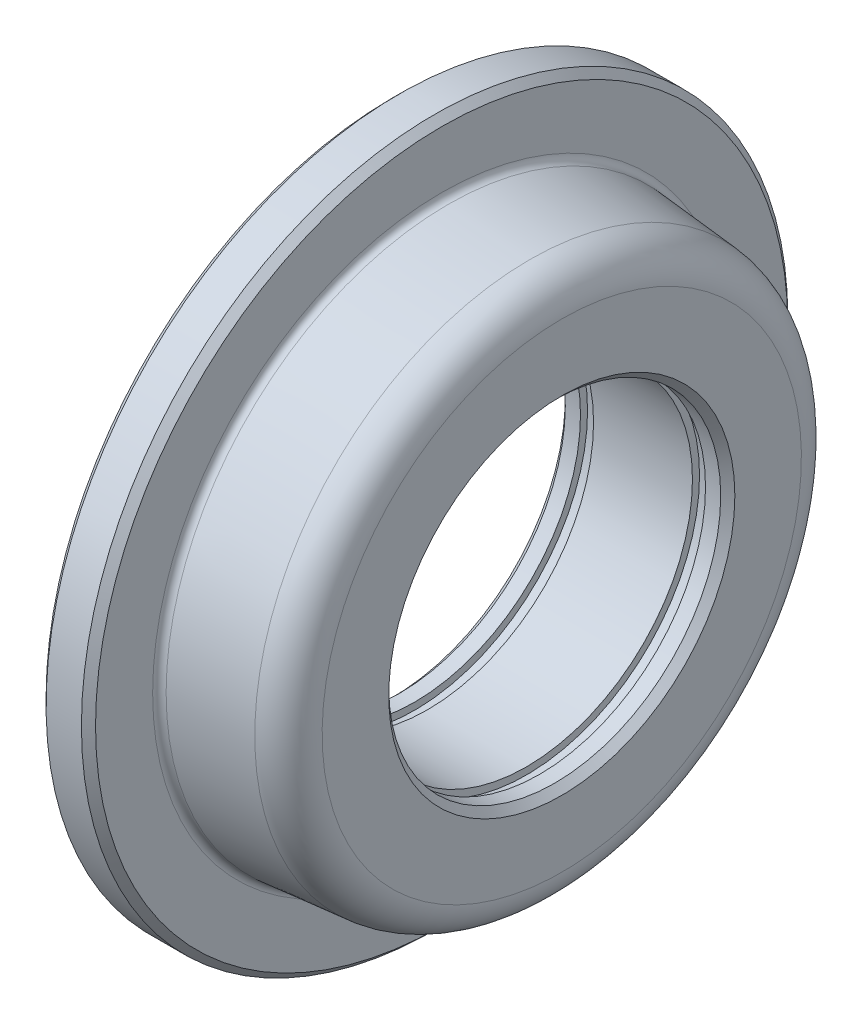
ISO-10303-21;
HEADER;
FILE_DESCRIPTION(('STEP AP214'),'2;1');
FILE_NAME('part.step','',(''),(''),'','','');
FILE_SCHEMA(('AUTOMOTIVE_DESIGN { 1 0 10303 214 1 1 1 1 }'));
ENDSEC;
DATA;
#1=APPLICATION_CONTEXT('core data for automotive mechanical design processes');
#2=APPLICATION_PROTOCOL_DEFINITION('international standard','automotive_design',2000,#1);
#3=PRODUCT_CONTEXT('',#1,'mechanical');
#4=PRODUCT('Part','Part','',(#3));
#5=PRODUCT_RELATED_PRODUCT_CATEGORY('part','',(#4));
#6=PRODUCT_DEFINITION_FORMATION('','',#4);
#7=PRODUCT_DEFINITION_CONTEXT('part definition',#1,'design');
#8=PRODUCT_DEFINITION('design','',#6,#7);
#9=PRODUCT_DEFINITION_SHAPE('','',#8);
#10=(LENGTH_UNIT() NAMED_UNIT(*) SI_UNIT(.MILLI.,.METRE.));
#11=(NAMED_UNIT(*) PLANE_ANGLE_UNIT() SI_UNIT($,.RADIAN.));
#12=(NAMED_UNIT(*) SI_UNIT($,.STERADIAN.) SOLID_ANGLE_UNIT());
#13=UNCERTAINTY_MEASURE_WITH_UNIT(LENGTH_MEASURE(1.E-05),#10,'distance_accuracy_value','');
#14=(GEOMETRIC_REPRESENTATION_CONTEXT(3) GLOBAL_UNCERTAINTY_ASSIGNED_CONTEXT((#13)) GLOBAL_UNIT_ASSIGNED_CONTEXT((#10,
#11,#12)) REPRESENTATION_CONTEXT('',''));
#15=CARTESIAN_POINT('',(0.,0.,0.));
#16=DIRECTION('',(0.,0.,1.));
#17=DIRECTION('',(1.,0.,0.));
#18=AXIS2_PLACEMENT_3D('',#15,#16,#17);
#19=CARTESIAN_POINT('',(22.425,0.,0.));
#20=DIRECTION('',(1.,0.,0.));
#21=DIRECTION('',(0.,0.,-1.));
#22=AXIS2_PLACEMENT_3D('',#19,#20,#21);
#23=CYLINDRICAL_SURFACE('',#22,23.5);
#24=CARTESIAN_POINT('',(23.0000000000013,0.,0.));
#25=DIRECTION('',(1.,0.,0.));
#26=DIRECTION('',(0.,-1.,0.));
#27=AXIS2_PLACEMENT_3D('',#24,#25,#26);
#28=CIRCLE('',#27,23.4999999999987);
#29=CARTESIAN_POINT('',(23.0000000000013,-23.4999999999987,0.));
#30=VERTEX_POINT('',#29);
#31=EDGE_CURVE('E67',#30,#30,#28,.T.);
#32=ORIENTED_EDGE('',*,*,#31,.T.);
#33=EDGE_LOOP('',(#32));
#34=FACE_BOUND('',#33,.T.);
#35=CARTESIAN_POINT('',(20.85,0.,0.));
#36=DIRECTION('',(1.,0.,0.));
#37=DIRECTION('',(0.,0.,-1.));
#38=AXIS2_PLACEMENT_3D('',#35,#36,#37);
#39=CIRCLE('',#38,23.5);
#40=CARTESIAN_POINT('',(20.85,0.,-23.5));
#41=VERTEX_POINT('',#40);
#42=EDGE_CURVE('E18',#41,#41,#39,.T.);
#43=ORIENTED_EDGE('',*,*,#42,.F.);
#44=EDGE_LOOP('',(#43));
#45=FACE_BOUND('',#44,.T.);
#46=ADVANCED_FACE('F15',(#34,#45),#23,.F.);
#47=CARTESIAN_POINT('',(23.9999999999987,0.,0.));
#48=DIRECTION('',(1.,0.,0.));
#49=DIRECTION('',(0.,0.,-1.));
#50=AXIS2_PLACEMENT_3D('',#47,#48,#49);
#51=CONICAL_SURFACE('',#50,24.5000000000013,0.785398163400002);
#52=ORIENTED_EDGE('',*,*,#31,.F.);
#53=EDGE_LOOP('',(#52));
#54=FACE_BOUND('',#53,.T.);
#55=CARTESIAN_POINT('',(23.9999999999987,0.,0.));
#56=DIRECTION('',(1.,0.,0.));
#57=DIRECTION('',(0.,0.,-1.));
#58=AXIS2_PLACEMENT_3D('',#55,#56,#57);
#59=CIRCLE('',#58,24.5000000000013);
#60=CARTESIAN_POINT('',(23.9999999999987,0.,-24.5000000000013));
#61=VERTEX_POINT('',#60);
#62=EDGE_CURVE('E62',#61,#61,#59,.F.);
#63=ORIENTED_EDGE('',*,*,#62,.F.);
#64=EDGE_LOOP('',(#63));
#65=FACE_BOUND('',#64,.T.);
#66=ADVANCED_FACE('F116',(#54,#65),#51,.F.);
#67=CARTESIAN_POINT('',(20.85,24.5,0.));
#68=DIRECTION('',(-1.,0.,0.));
#69=DIRECTION('',(0.,0.,1.));
#70=AXIS2_PLACEMENT_3D('',#67,#68,#69);
#71=PLANE('',#70);
#72=ORIENTED_EDGE('',*,*,#42,.T.);
#73=EDGE_LOOP('',(#72));
#74=FACE_BOUND('',#73,.T.);
#75=CARTESIAN_POINT('',(20.85,0.,0.));
#76=DIRECTION('',(1.,0.,0.));
#77=DIRECTION('',(0.,0.,-1.));
#78=AXIS2_PLACEMENT_3D('',#75,#76,#77);
#79=CIRCLE('',#78,24.5);
#80=CARTESIAN_POINT('',(20.85,0.,-24.5));
#81=VERTEX_POINT('',#80);
#82=EDGE_CURVE('E60',#81,#81,#79,.F.);
#83=ORIENTED_EDGE('',*,*,#82,.T.);
#84=EDGE_LOOP('',(#83));
#85=FACE_BOUND('',#84,.T.);
#86=ADVANCED_FACE('F114',(#74,#85),#71,.T.);
#87=CARTESIAN_POINT('',(24.,23.5,0.));
#88=DIRECTION('',(1.,0.,0.));
#89=DIRECTION('',(0.,0.,-1.));
#90=AXIS2_PLACEMENT_3D('',#87,#88,#89);
#91=PLANE('',#90);
#92=ORIENTED_EDGE('',*,*,#62,.T.);
#93=EDGE_LOOP('',(#92));
#94=FACE_BOUND('',#93,.T.);
#95=CARTESIAN_POINT('',(24.,0.,0.));
#96=DIRECTION('',(-1.,0.,0.));
#97=DIRECTION('',(0.,1.,0.));
#98=AXIS2_PLACEMENT_3D('',#95,#96,#97);
#99=CIRCLE('',#98,33.9217505394482);
#100=CARTESIAN_POINT('',(24.,33.9217505394482,0.));
#101=VERTEX_POINT('',#100);
#102=EDGE_CURVE('E59',#101,#101,#99,.T.);
#103=ORIENTED_EDGE('',*,*,#102,.F.);
#104=EDGE_LOOP('',(#103));
#105=FACE_BOUND('',#104,.T.);
#106=ADVANCED_FACE('F105',(#94,#105),#91,.T.);
#107=CARTESIAN_POINT('',(19.925,0.,0.));
#108=DIRECTION('',(1.,0.,0.));
#109=DIRECTION('',(0.,0.,-1.));
#110=AXIS2_PLACEMENT_3D('',#107,#108,#109);
#111=CYLINDRICAL_SURFACE('',#110,24.5);
#112=CARTESIAN_POINT('',(19.,0.,0.));
#113=DIRECTION('',(1.,0.,0.));
#114=DIRECTION('',(0.,0.,-1.));
#115=AXIS2_PLACEMENT_3D('',#112,#113,#114);
#116=CIRCLE('',#115,24.5);
#117=CARTESIAN_POINT('',(19.,0.,-24.5));
#118=VERTEX_POINT('',#117);
#119=EDGE_CURVE('E56',#118,#118,#116,.T.);
#120=ORIENTED_EDGE('',*,*,#119,.F.);
#121=EDGE_LOOP('',(#120));
#122=FACE_BOUND('',#121,.T.);
#123=ORIENTED_EDGE('',*,*,#82,.F.);
#124=EDGE_LOOP('',(#123));
#125=FACE_BOUND('',#124,.T.);
#126=ADVANCED_FACE('F92',(#122,#125),#111,.F.);
#127=CARTESIAN_POINT('',(19.,0.,0.));
#128=DIRECTION('',(1.,0.,0.));
#129=DIRECTION('',(0.,0.,-1.));
#130=AXIS2_PLACEMENT_3D('',#127,#128,#129);
#131=TOROIDAL_SURFACE('',#130,33.9217505394482,5.);
#132=ORIENTED_EDGE('',*,*,#102,.T.);
#133=EDGE_LOOP('',(#132));
#134=FACE_BOUND('',#133,.T.);
#135=CARTESIAN_POINT('',(19.4394690514817,0.,0.));
#136=DIRECTION('',(-1.,0.,0.));
#137=DIRECTION('',(0.,1.,0.));
#138=AXIS2_PLACEMENT_3D('',#135,#136,#137);
#139=CIRCLE('',#138,38.902399789574);
#140=CARTESIAN_POINT('',(19.4394690514817,38.902399789574,0.));
#141=VERTEX_POINT('',#140);
#142=EDGE_CURVE('E55',#141,#141,#139,.T.);
#143=ORIENTED_EDGE('',*,*,#142,.F.);
#144=EDGE_LOOP('',(#143));
#145=FACE_BOUND('',#144,.T.);
#146=ADVANCED_FACE('F80',(#134,#145),#131,.T.);
#147=CARTESIAN_POINT('',(19.,23.5,0.));
#148=DIRECTION('',(1.,0.,0.));
#149=DIRECTION('',(0.,0.,-1.));
#150=AXIS2_PLACEMENT_3D('',#147,#148,#149);
#151=PLANE('',#150);
#152=CARTESIAN_POINT('',(19.,0.,0.));
#153=DIRECTION('',(1.,0.,0.));
#154=DIRECTION('',(0.,0.,-1.));
#155=AXIS2_PLACEMENT_3D('',#152,#153,#154);
#156=CIRCLE('',#155,23.5);
#157=CARTESIAN_POINT('',(19.,0.,-23.5));
#158=VERTEX_POINT('',#157);
#159=EDGE_CURVE('E52',#158,#158,#156,.F.);
#160=ORIENTED_EDGE('',*,*,#159,.T.);
#161=EDGE_LOOP('',(#160));
#162=FACE_BOUND('',#161,.T.);
#163=ORIENTED_EDGE('',*,*,#119,.T.);
#164=EDGE_LOOP('',(#163));
#165=FACE_BOUND('',#164,.T.);
#166=ADVANCED_FACE('F91',(#162,#165),#151,.T.);
#167=CARTESIAN_POINT('',(7.91210618970377,0.,0.));
#168=DIRECTION('',(-1.,0.,0.));
#169=DIRECTION('',(0.,0.,1.));
#170=AXIS2_PLACEMENT_3D('',#167,#168,#169);
#171=CONICAL_SURFACE('',#170,39.9195200420871,0.0880073735280265);
#172=ORIENTED_EDGE('',*,*,#142,.T.);
#173=EDGE_LOOP('',(#172));
#174=FACE_BOUND('',#173,.T.);
#175=CARTESIAN_POINT('',(7.91210618970364,0.,0.));
#176=DIRECTION('',(1.,0.,0.));
#177=DIRECTION('',(0.,0.,-1.));
#178=AXIS2_PLACEMENT_3D('',#175,#176,#177);
#179=CIRCLE('',#178,39.919520042085);
#180=CARTESIAN_POINT('',(7.91210618970364,0.,-39.919520042085));
#181=VERTEX_POINT('',#180);
#182=EDGE_CURVE('E51',#181,#181,#179,.T.);
#183=ORIENTED_EDGE('',*,*,#182,.T.);
#184=EDGE_LOOP('',(#183));
#185=FACE_BOUND('',#184,.T.);
#186=ADVANCED_FACE('F200',(#174,#185),#171,.T.);
#187=CARTESIAN_POINT('',(12.,0.,0.));
#188=DIRECTION('',(1.,0.,0.));
#189=DIRECTION('',(0.,0.,-1.));
#190=AXIS2_PLACEMENT_3D('',#187,#188,#189);
#191=CYLINDRICAL_SURFACE('',#190,23.5);
#192=CARTESIAN_POINT('',(5.,0.,0.));
#193=DIRECTION('',(1.,0.,0.));
#194=DIRECTION('',(0.,0.,-1.));
#195=AXIS2_PLACEMENT_3D('',#192,#193,#194);
#196=CIRCLE('',#195,23.5);
#197=CARTESIAN_POINT('',(5.,0.,-23.5));
#198=VERTEX_POINT('',#197);
#199=EDGE_CURVE('E48',#198,#198,#196,.T.);
#200=ORIENTED_EDGE('',*,*,#199,.F.);
#201=EDGE_LOOP('',(#200));
#202=FACE_BOUND('',#201,.T.);
#203=ORIENTED_EDGE('',*,*,#159,.F.);
#204=EDGE_LOOP('',(#203));
#205=FACE_BOUND('',#204,.T.);
#206=ADVANCED_FACE('F185',(#202,#205),#191,.F.);
#207=CARTESIAN_POINT('',(7.99999999999999,0.,0.));
#208=DIRECTION('',(1.,0.,0.));
#209=DIRECTION('',(0.,0.,-1.));
#210=AXIS2_PLACEMENT_3D('',#207,#208,#209);
#211=TOROIDAL_SURFACE('',#210,40.9156498921104,1.);
#212=ORIENTED_EDGE('',*,*,#182,.F.);
#213=EDGE_LOOP('',(#212));
#214=FACE_BOUND('',#213,.T.);
#215=CARTESIAN_POINT('',(6.99999999999999,0.,0.));
#216=DIRECTION('',(1.,0.,0.));
#217=DIRECTION('',(0.,1.,0.));
#218=AXIS2_PLACEMENT_3D('',#215,#216,#217);
#219=CIRCLE('',#218,40.9156498921104);
#220=CARTESIAN_POINT('',(6.99999999999999,40.9156498921104,0.));
#221=VERTEX_POINT('',#220);
#222=EDGE_CURVE('E47',#221,#221,#219,.F.);
#223=ORIENTED_EDGE('',*,*,#222,.F.);
#224=EDGE_LOOP('',(#223));
#225=FACE_BOUND('',#224,.T.);
#226=ADVANCED_FACE('F181',(#214,#225),#211,.F.);
#227=CARTESIAN_POINT('',(5.,24.5,0.));
#228=DIRECTION('',(-1.,0.,0.));
#229=DIRECTION('',(0.,0.,1.));
#230=AXIS2_PLACEMENT_3D('',#227,#228,#229);
#231=PLANE('',#230);
#232=ORIENTED_EDGE('',*,*,#199,.T.);
#233=EDGE_LOOP('',(#232));
#234=FACE_BOUND('',#233,.T.);
#235=CARTESIAN_POINT('',(5.,0.,0.));
#236=DIRECTION('',(1.,0.,0.));
#237=DIRECTION('',(0.,0.,-1.));
#238=AXIS2_PLACEMENT_3D('',#235,#236,#237);
#239=CIRCLE('',#238,24.5);
#240=CARTESIAN_POINT('',(5.,0.,-24.5));
#241=VERTEX_POINT('',#240);
#242=EDGE_CURVE('E44',#241,#241,#239,.F.);
#243=ORIENTED_EDGE('',*,*,#242,.T.);
#244=EDGE_LOOP('',(#243));
#245=FACE_BOUND('',#244,.T.);
#246=ADVANCED_FACE('F163',(#234,#245),#231,.T.);
#247=CARTESIAN_POINT('',(6.99999999999999,40.,0.));
#248=DIRECTION('',(1.,0.,0.));
#249=DIRECTION('',(0.,0.,-1.));
#250=AXIS2_PLACEMENT_3D('',#247,#248,#249);
#251=PLANE('',#250);
#252=ORIENTED_EDGE('',*,*,#222,.T.);
#253=EDGE_LOOP('',(#252));
#254=FACE_BOUND('',#253,.T.);
#255=CARTESIAN_POINT('',(6.99999999999872,0.,0.));
#256=DIRECTION('',(-1.,0.,0.));
#257=DIRECTION('',(0.,0.,1.));
#258=AXIS2_PLACEMENT_3D('',#255,#256,#257);
#259=CIRCLE('',#258,48.9999999999987);
#260=CARTESIAN_POINT('',(6.99999999999872,0.,48.9999999999987));
#261=VERTEX_POINT('',#260);
#262=EDGE_CURVE('E41',#261,#261,#259,.T.);
#263=ORIENTED_EDGE('',*,*,#262,.F.);
#264=EDGE_LOOP('',(#263));
#265=FACE_BOUND('',#264,.T.);
#266=ADVANCED_FACE('F158',(#254,#265),#251,.T.);
#267=CARTESIAN_POINT('',(4.075,0.,0.));
#268=DIRECTION('',(1.,0.,0.));
#269=DIRECTION('',(0.,0.,-1.));
#270=AXIS2_PLACEMENT_3D('',#267,#268,#269);
#271=CYLINDRICAL_SURFACE('',#270,24.5);
#272=CARTESIAN_POINT('',(3.15,0.,0.));
#273=DIRECTION('',(1.,0.,0.));
#274=DIRECTION('',(0.,0.,-1.));
#275=AXIS2_PLACEMENT_3D('',#272,#273,#274);
#276=CIRCLE('',#275,24.5);
#277=CARTESIAN_POINT('',(3.15,0.,-24.5));
#278=VERTEX_POINT('',#277);
#279=EDGE_CURVE('E38',#278,#278,#276,.T.);
#280=ORIENTED_EDGE('',*,*,#279,.F.);
#281=EDGE_LOOP('',(#280));
#282=FACE_BOUND('',#281,.T.);
#283=ORIENTED_EDGE('',*,*,#242,.F.);
#284=EDGE_LOOP('',(#283));
#285=FACE_BOUND('',#284,.T.);
#286=ADVANCED_FACE('F154',(#282,#285),#271,.F.);
#287=CARTESIAN_POINT('',(6.00000000000126,0.,0.));
#288=DIRECTION('',(-1.,0.,0.));
#289=DIRECTION('',(0.,0.,1.));
#290=AXIS2_PLACEMENT_3D('',#287,#288,#289);
#291=CONICAL_SURFACE('',#290,50.0000000000013,0.785398163399993);
#292=ORIENTED_EDGE('',*,*,#262,.T.);
#293=EDGE_LOOP('',(#292));
#294=FACE_BOUND('',#293,.T.);
#295=CARTESIAN_POINT('',(5.99999999999999,0.,0.));
#296=DIRECTION('',(1.,0.,0.));
#297=DIRECTION('',(0.,0.,-1.));
#298=AXIS2_PLACEMENT_3D('',#295,#296,#297);
#299=CIRCLE('',#298,50.);
#300=CARTESIAN_POINT('',(5.99999999999999,0.,-50.));
#301=VERTEX_POINT('',#300);
#302=EDGE_CURVE('E37',#301,#301,#299,.F.);
#303=ORIENTED_EDGE('',*,*,#302,.F.);
#304=EDGE_LOOP('',(#303));
#305=FACE_BOUND('',#304,.T.);
#306=ADVANCED_FACE('F150',(#294,#305),#291,.T.);
#307=CARTESIAN_POINT('',(3.15,23.5,0.));
#308=DIRECTION('',(1.,0.,0.));
#309=DIRECTION('',(0.,0.,-1.));
#310=AXIS2_PLACEMENT_3D('',#307,#308,#309);
#311=PLANE('',#310);
#312=CARTESIAN_POINT('',(3.15,0.,0.));
#313=DIRECTION('',(1.,0.,0.));
#314=DIRECTION('',(0.,0.,-1.));
#315=AXIS2_PLACEMENT_3D('',#312,#313,#314);
#316=CIRCLE('',#315,23.5);
#317=CARTESIAN_POINT('',(3.15,0.,-23.5));
#318=VERTEX_POINT('',#317);
#319=EDGE_CURVE('E33',#318,#318,#316,.F.);
#320=ORIENTED_EDGE('',*,*,#319,.T.);
#321=EDGE_LOOP('',(#320));
#322=FACE_BOUND('',#321,.T.);
#323=ORIENTED_EDGE('',*,*,#279,.T.);
#324=EDGE_LOOP('',(#323));
#325=FACE_BOUND('',#324,.T.);
#326=ADVANCED_FACE('F146',(#322,#325),#311,.T.);
#327=CARTESIAN_POINT('',(3.5,0.,0.));
#328=DIRECTION('',(1.,0.,0.));
#329=DIRECTION('',(0.,0.,-1.));
#330=AXIS2_PLACEMENT_3D('',#327,#328,#329);
#331=CYLINDRICAL_SURFACE('',#330,50.);
#332=ORIENTED_EDGE('',*,*,#302,.T.);
#333=EDGE_LOOP('',(#332));
#334=FACE_BOUND('',#333,.T.);
#335=CARTESIAN_POINT('',(0.999999999998724,0.,0.));
#336=DIRECTION('',(1.,0.,0.));
#337=DIRECTION('',(0.,-1.,0.));
#338=AXIS2_PLACEMENT_3D('',#335,#336,#337);
#339=CIRCLE('',#338,50.0000000000013);
#340=CARTESIAN_POINT('',(0.999999999998724,-50.0000000000013,0.));
#341=VERTEX_POINT('',#340);
#342=EDGE_CURVE('E36',#341,#341,#339,.F.);
#343=ORIENTED_EDGE('',*,*,#342,.F.);
#344=EDGE_LOOP('',(#343));
#345=FACE_BOUND('',#344,.T.);
#346=ADVANCED_FACE('F142',(#334,#345),#331,.T.);
#347=CARTESIAN_POINT('',(1.575,0.,0.));
#348=DIRECTION('',(1.,0.,0.));
#349=DIRECTION('',(0.,0.,-1.));
#350=AXIS2_PLACEMENT_3D('',#347,#348,#349);
#351=CYLINDRICAL_SURFACE('',#350,23.5);
#352=CARTESIAN_POINT('',(0.999999999998721,0.,0.));
#353=DIRECTION('',(-1.,0.,0.));
#354=DIRECTION('',(0.,-1.,0.));
#355=AXIS2_PLACEMENT_3D('',#352,#353,#354);
#356=CIRCLE('',#355,23.4999999999987);
#357=CARTESIAN_POINT('',(0.999999999998722,-23.4999999999987,0.));
#358=VERTEX_POINT('',#357);
#359=EDGE_CURVE('E27',#358,#358,#356,.T.);
#360=ORIENTED_EDGE('',*,*,#359,.T.);
#361=EDGE_LOOP('',(#360));
#362=FACE_BOUND('',#361,.T.);
#363=ORIENTED_EDGE('',*,*,#319,.F.);
#364=EDGE_LOOP('',(#363));
#365=FACE_BOUND('',#364,.T.);
#366=ADVANCED_FACE('F138',(#362,#365),#351,.F.);
#367=CARTESIAN_POINT('',(0.999999999998724,0.,0.));
#368=DIRECTION('',(1.,0.,0.));
#369=DIRECTION('',(0.,0.,-1.));
#370=AXIS2_PLACEMENT_3D('',#367,#368,#369);
#371=CONICAL_SURFACE('',#370,50.0000000000013,0.785398163399998);
#372=ORIENTED_EDGE('',*,*,#342,.T.);
#373=EDGE_LOOP('',(#372));
#374=FACE_BOUND('',#373,.T.);
#375=CARTESIAN_POINT('',(1.27675647831893E-12,0.,0.));
#376=DIRECTION('',(1.,0.,0.));
#377=DIRECTION('',(0.,0.,-1.));
#378=AXIS2_PLACEMENT_3D('',#375,#376,#377);
#379=CIRCLE('',#378,48.9999999999987);
#380=CARTESIAN_POINT('',(1.27675647831893E-12,0.,-48.9999999999987));
#381=VERTEX_POINT('',#380);
#382=EDGE_CURVE('E22',#381,#381,#379,.F.);
#383=ORIENTED_EDGE('',*,*,#382,.F.);
#384=EDGE_LOOP('',(#383));
#385=FACE_BOUND('',#384,.T.);
#386=ADVANCED_FACE('F131',(#374,#385),#371,.T.);
#387=CARTESIAN_POINT('',(1.27881646244665E-12,0.,0.));
#388=DIRECTION('',(-1.,0.,0.));
#389=DIRECTION('',(0.,0.,1.));
#390=AXIS2_PLACEMENT_3D('',#387,#388,#389);
#391=CONICAL_SURFACE('',#390,24.5000000000013,0.785398163400004);
#392=CARTESIAN_POINT('',(1.27881646244665E-12,0.,0.));
#393=DIRECTION('',(-1.,0.,0.));
#394=DIRECTION('',(0.,0.,1.));
#395=AXIS2_PLACEMENT_3D('',#392,#393,#394);
#396=CIRCLE('',#395,24.5000000000013);
#397=CARTESIAN_POINT('',(1.27881646244665E-12,0.,24.5000000000013));
#398=VERTEX_POINT('',#397);
#399=EDGE_CURVE('E10',#398,#398,#396,.F.);
#400=ORIENTED_EDGE('',*,*,#399,.F.);
#401=EDGE_LOOP('',(#400));
#402=FACE_BOUND('',#401,.T.);
#403=ORIENTED_EDGE('',*,*,#359,.F.);
#404=EDGE_LOOP('',(#403));
#405=FACE_BOUND('',#404,.T.);
#406=ADVANCED_FACE('F126',(#402,#405),#391,.F.);
#407=CARTESIAN_POINT('',(0.,50.,0.));
#408=DIRECTION('',(-1.,0.,0.));
#409=DIRECTION('',(0.,0.,1.));
#410=AXIS2_PLACEMENT_3D('',#407,#408,#409);
#411=PLANE('',#410);
#412=ORIENTED_EDGE('',*,*,#399,.T.);
#413=EDGE_LOOP('',(#412));
#414=FACE_BOUND('',#413,.T.);
#415=ORIENTED_EDGE('',*,*,#382,.T.);
#416=EDGE_LOOP('',(#415));
#417=FACE_BOUND('',#416,.T.);
#418=ADVANCED_FACE('F124',(#414,#417),#411,.T.);
#419=CLOSED_SHELL('',(#46,#66,#86,#106,#126,#146,#166,#186,#206,#226,#246,#266,#286,#306,#326,
#346,#366,#386,#406,#418));
#420=MANIFOLD_SOLID_BREP('B1',#419);
#421=ADVANCED_BREP_SHAPE_REPRESENTATION('',(#18,#420),#14);
#422=SHAPE_DEFINITION_REPRESENTATION(#9,#421);
ENDSEC;
END-ISO-10303-21;
